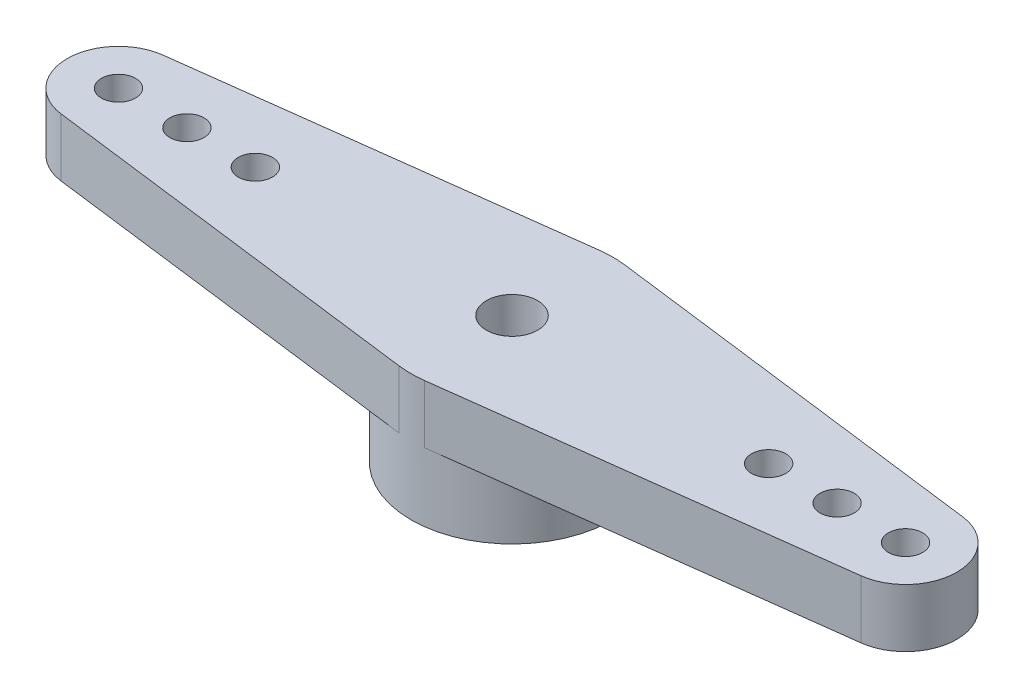
ISO-10303-21;
HEADER;
FILE_DESCRIPTION(('STEP AP214'),'2;1');
FILE_NAME('part.step','',(''),(''),'','','');
FILE_SCHEMA(('AUTOMOTIVE_DESIGN { 1 0 10303 214 1 1 1 1 }'));
ENDSEC;
DATA;
#1=APPLICATION_CONTEXT('core data for automotive mechanical design processes');
#2=APPLICATION_PROTOCOL_DEFINITION('international standard','automotive_design',2000,#1);
#3=PRODUCT_CONTEXT('',#1,'mechanical');
#4=PRODUCT('Part','Part','',(#3));
#5=PRODUCT_RELATED_PRODUCT_CATEGORY('part','',(#4));
#6=PRODUCT_DEFINITION_FORMATION('','',#4);
#7=PRODUCT_DEFINITION_CONTEXT('part definition',#1,'design');
#8=PRODUCT_DEFINITION('design','',#6,#7);
#9=PRODUCT_DEFINITION_SHAPE('','',#8);
#10=(LENGTH_UNIT() NAMED_UNIT(*) SI_UNIT(.MILLI.,.METRE.));
#11=(NAMED_UNIT(*) PLANE_ANGLE_UNIT() SI_UNIT($,.RADIAN.));
#12=(NAMED_UNIT(*) SI_UNIT($,.STERADIAN.) SOLID_ANGLE_UNIT());
#13=UNCERTAINTY_MEASURE_WITH_UNIT(LENGTH_MEASURE(1.E-05),#10,'distance_accuracy_value','');
#14=(GEOMETRIC_REPRESENTATION_CONTEXT(3) GLOBAL_UNCERTAINTY_ASSIGNED_CONTEXT((#13)) GLOBAL_UNIT_ASSIGNED_CONTEXT((#10,
#11,#12)) REPRESENTATION_CONTEXT('',''));
#15=CARTESIAN_POINT('',(0.,0.,0.));
#16=DIRECTION('',(0.,0.,1.));
#17=DIRECTION('',(1.,0.,0.));
#18=AXIS2_PLACEMENT_3D('',#15,#16,#17);
#19=CARTESIAN_POINT('',(0.,0.,0.));
#20=DIRECTION('',(0.,1.,0.));
#21=DIRECTION('',(0.,0.,1.));
#22=AXIS2_PLACEMENT_3D('',#19,#20,#21);
#23=PLANE('',#22);
#24=CARTESIAN_POINT('',(0.,0.,0.));
#25=DIRECTION('',(0.,1.,0.));
#26=DIRECTION('',(0.,0.,1.));
#27=AXIS2_PLACEMENT_3D('',#24,#25,#26);
#28=CIRCLE('',#27,2.95);
#29=CARTESIAN_POINT('',(0.,0.,2.95));
#30=VERTEX_POINT('',#29);
#31=EDGE_CURVE('E37',#30,#30,#28,.T.);
#32=ORIENTED_EDGE('',*,*,#31,.F.);
#33=EDGE_LOOP('',(#32));
#34=FACE_BOUND('',#33,.T.);
#35=CARTESIAN_POINT('',(0.,0.,0.));
#36=DIRECTION('',(0.,1.,0.));
#37=DIRECTION('',(0.,0.,1.));
#38=AXIS2_PLACEMENT_3D('',#35,#36,#37);
#39=CIRCLE('',#38,1.9);
#40=CARTESIAN_POINT('',(0.,0.,1.9));
#41=VERTEX_POINT('',#40);
#42=EDGE_CURVE('E121',#41,#41,#39,.T.);
#43=ORIENTED_EDGE('',*,*,#42,.T.);
#44=EDGE_LOOP('',(#43));
#45=FACE_BOUND('',#44,.T.);
#46=ADVANCED_FACE('F33',(#34,#45),#23,.F.);
#47=CARTESIAN_POINT('',(0.,2.,0.));
#48=DIRECTION('',(0.,-1.,0.));
#49=DIRECTION('',(0.,0.,-1.));
#50=AXIS2_PLACEMENT_3D('',#47,#48,#49);
#51=CYLINDRICAL_SURFACE('',#50,2.95);
#52=CARTESIAN_POINT('',(0.,2.,0.));
#53=DIRECTION('',(0.,1.,0.));
#54=DIRECTION('',(0.,0.,1.));
#55=AXIS2_PLACEMENT_3D('',#52,#53,#54);
#56=CIRCLE('',#55,2.95);
#57=CARTESIAN_POINT('',(0.37195652173913,2.,2.92645661952057));
#58=VERTEX_POINT('',#57);
#59=CARTESIAN_POINT('',(0.371956521739131,2.,-2.92645661952057));
#60=VERTEX_POINT('',#59);
#61=EDGE_CURVE('E11',#58,#60,#56,.T.);
#62=ORIENTED_EDGE('',*,*,#61,.F.);
#63=DIRECTION('',(0.,-1.,0.));
#64=VECTOR('',#63,1.);
#65=CARTESIAN_POINT('',(0.37195652173913,3.7,2.92645661952057));
#66=LINE('',#65,#64);
#67=CARTESIAN_POINT('',(0.37195652173913,3.7,2.92645661952057));
#68=VERTEX_POINT('',#67);
#69=EDGE_CURVE('E279',#68,#58,#66,.T.);
#70=ORIENTED_EDGE('',*,*,#69,.F.);
#71=CARTESIAN_POINT('',(0.,3.7,0.));
#72=DIRECTION('',(0.,1.,0.));
#73=DIRECTION('',(0.,0.,1.));
#74=AXIS2_PLACEMENT_3D('',#71,#72,#73);
#75=CIRCLE('',#74,2.95);
#76=CARTESIAN_POINT('',(-0.371956521739131,3.7,2.92645661952057));
#77=VERTEX_POINT('',#76);
#78=EDGE_CURVE('E253',#77,#68,#75,.T.);
#79=ORIENTED_EDGE('',*,*,#78,.F.);
#80=DIRECTION('',(0.,-1.,0.));
#81=VECTOR('',#80,1.);
#82=CARTESIAN_POINT('',(-0.371956521739131,3.7,2.92645661952057));
#83=LINE('',#82,#81);
#84=CARTESIAN_POINT('',(-0.371956521739131,2.,2.92645661952057));
#85=VERTEX_POINT('',#84);
#86=EDGE_CURVE('E282',#77,#85,#83,.T.);
#87=ORIENTED_EDGE('',*,*,#86,.T.);
#88=CARTESIAN_POINT('',(-0.371956521739131,2.,-2.92645661952057));
#89=VERTEX_POINT('',#88);
#90=EDGE_CURVE('E42',#89,#85,#56,.T.);
#91=ORIENTED_EDGE('',*,*,#90,.F.);
#92=DIRECTION('',(0.,-1.,0.));
#93=VECTOR('',#92,1.);
#94=CARTESIAN_POINT('',(-0.371956521739131,3.7,-2.92645661952057));
#95=LINE('',#94,#93);
#96=CARTESIAN_POINT('',(-0.371956521739131,3.7,-2.92645661952057));
#97=VERTEX_POINT('',#96);
#98=EDGE_CURVE('E100',#97,#89,#95,.T.);
#99=ORIENTED_EDGE('',*,*,#98,.F.);
#100=CARTESIAN_POINT('',(0.,3.7,0.));
#101=DIRECTION('',(0.,1.,0.));
#102=DIRECTION('',(0.,0.,1.));
#103=AXIS2_PLACEMENT_3D('',#100,#101,#102);
#104=CIRCLE('',#103,2.95);
#105=CARTESIAN_POINT('',(0.371956521739131,3.7,-2.92645661952057));
#106=VERTEX_POINT('',#105);
#107=EDGE_CURVE('E106',#106,#97,#104,.T.);
#108=ORIENTED_EDGE('',*,*,#107,.F.);
#109=DIRECTION('',(0.,-1.,0.));
#110=VECTOR('',#109,1.);
#111=CARTESIAN_POINT('',(0.371956521739131,3.7,-2.92645661952057));
#112=LINE('',#111,#110);
#113=EDGE_CURVE('E260',#106,#60,#112,.T.);
#114=ORIENTED_EDGE('',*,*,#113,.T.);
#115=EDGE_LOOP('',(#62,#70,#79,#87,#91,#99,#108,#114));
#116=FACE_BOUND('',#115,.T.);
#117=ORIENTED_EDGE('',*,*,#31,.T.);
#118=EDGE_LOOP('',(#117));
#119=FACE_BOUND('',#118,.T.);
#120=ADVANCED_FACE('F35',(#116,#119),#51,.T.);
#121=CARTESIAN_POINT('',(0.,2.,0.));
#122=DIRECTION('',(0.,-1.,0.));
#123=DIRECTION('',(0.,0.,-1.));
#124=AXIS2_PLACEMENT_3D('',#121,#122,#123);
#125=CYLINDRICAL_SURFACE('',#124,1.9);
#126=CARTESIAN_POINT('',(0.,2.,0.));
#127=DIRECTION('',(0.,1.,0.));
#128=DIRECTION('',(0.,0.,1.));
#129=AXIS2_PLACEMENT_3D('',#126,#127,#128);
#130=CIRCLE('',#129,1.9);
#131=CARTESIAN_POINT('',(0.,2.,1.9));
#132=VERTEX_POINT('',#131);
#133=EDGE_CURVE('E118',#132,#132,#130,.T.);
#134=ORIENTED_EDGE('',*,*,#133,.T.);
#135=EDGE_LOOP('',(#134));
#136=FACE_BOUND('',#135,.T.);
#137=ORIENTED_EDGE('',*,*,#42,.F.);
#138=EDGE_LOOP('',(#137));
#139=FACE_BOUND('',#138,.T.);
#140=ADVANCED_FACE('F137',(#136,#139),#125,.F.);
#141=CARTESIAN_POINT('',(0.,2.,0.));
#142=DIRECTION('',(0.,1.,0.));
#143=DIRECTION('',(0.,0.,1.));
#144=AXIS2_PLACEMENT_3D('',#141,#142,#143);
#145=PLANE('',#144);
#146=CARTESIAN_POINT('',(7.5,2.,0.));
#147=DIRECTION('',(0.,1.,0.));
#148=DIRECTION('',(0.,0.,-1.));
#149=AXIS2_PLACEMENT_3D('',#146,#147,#148);
#150=CIRCLE('',#149,0.500000000000001);
#151=CARTESIAN_POINT('',(7.5,2.,-0.500000000000001));
#152=VERTEX_POINT('',#151);
#153=EDGE_CURVE('E223',#152,#152,#150,.T.);
#154=ORIENTED_EDGE('',*,*,#153,.T.);
#155=EDGE_LOOP('',(#154));
#156=FACE_BOUND('',#155,.T.);
#157=CARTESIAN_POINT('',(9.5,2.,0.));
#158=DIRECTION('',(0.,1.,0.));
#159=DIRECTION('',(0.,0.,-1.));
#160=AXIS2_PLACEMENT_3D('',#157,#158,#159);
#161=CIRCLE('',#160,0.500000000000001);
#162=CARTESIAN_POINT('',(9.5,2.,-0.500000000000001));
#163=VERTEX_POINT('',#162);
#164=EDGE_CURVE('E217',#163,#163,#161,.T.);
#165=ORIENTED_EDGE('',*,*,#164,.T.);
#166=EDGE_LOOP('',(#165));
#167=FACE_BOUND('',#166,.T.);
#168=CARTESIAN_POINT('',(11.5,2.,0.));
#169=DIRECTION('',(0.,1.,0.));
#170=DIRECTION('',(0.,0.,-1.));
#171=AXIS2_PLACEMENT_3D('',#168,#169,#170);
#172=CIRCLE('',#171,0.500000000000001);
#173=CARTESIAN_POINT('',(11.5,2.,-0.500000000000001));
#174=VERTEX_POINT('',#173);
#175=EDGE_CURVE('E211',#174,#174,#172,.T.);
#176=ORIENTED_EDGE('',*,*,#175,.T.);
#177=EDGE_LOOP('',(#176));
#178=FACE_BOUND('',#177,.T.);
#179=DIRECTION('',(0.992019193057818,0.,-0.126086956521739));
#180=VECTOR('',#179,1.);
#181=CARTESIAN_POINT('',(0.371956521739131,2.,2.92645661952057));
#182=LINE('',#181,#180);
#183=CARTESIAN_POINT('',(11.6891304347826,2.,1.48802878958673));
#184=VERTEX_POINT('',#183);
#185=EDGE_CURVE('E266',#58,#184,#182,.T.);
#186=ORIENTED_EDGE('',*,*,#185,.F.);
#187=ORIENTED_EDGE('',*,*,#61,.T.);
#188=DIRECTION('',(-0.992019193057818,0.,-0.126086956521739));
#189=VECTOR('',#188,1.);
#190=CARTESIAN_POINT('',(0.371956521739131,2.,-2.92645661952057));
#191=LINE('',#190,#189);
#192=CARTESIAN_POINT('',(11.6891304347826,2.,-1.48802878958673));
#193=VERTEX_POINT('',#192);
#194=EDGE_CURVE('E115',#193,#60,#191,.T.);
#195=ORIENTED_EDGE('',*,*,#194,.F.);
#196=CARTESIAN_POINT('',(11.5,2.,0.));
#197=DIRECTION('',(0.,1.,0.));
#198=DIRECTION('',(0.,0.,-1.));
#199=AXIS2_PLACEMENT_3D('',#196,#197,#198);
#200=CIRCLE('',#199,1.5);
#201=EDGE_CURVE('E268',#184,#193,#200,.T.);
#202=ORIENTED_EDGE('',*,*,#201,.F.);
#203=EDGE_LOOP('',(#186,#187,#195,#202));
#204=FACE_BOUND('',#203,.T.);
#205=ADVANCED_FACE('F141',(#156,#167,#178,#204),#145,.F.);
#206=CARTESIAN_POINT('',(-11.5,2.,0.));
#207=DIRECTION('',(0.,1.,0.));
#208=DIRECTION('',(0.,0.,1.));
#209=AXIS2_PLACEMENT_3D('',#206,#207,#208);
#210=CIRCLE('',#209,0.500000000000001);
#211=CARTESIAN_POINT('',(-11.5,2.,0.500000000000001));
#212=VERTEX_POINT('',#211);
#213=EDGE_CURVE('E241',#212,#212,#210,.T.);
#214=ORIENTED_EDGE('',*,*,#213,.T.);
#215=EDGE_LOOP('',(#214));
#216=FACE_BOUND('',#215,.T.);
#217=CARTESIAN_POINT('',(-9.5,2.,0.));
#218=DIRECTION('',(0.,1.,0.));
#219=DIRECTION('',(0.,0.,1.));
#220=AXIS2_PLACEMENT_3D('',#217,#218,#219);
#221=CIRCLE('',#220,0.500000000000001);
#222=CARTESIAN_POINT('',(-9.5,2.,0.500000000000001));
#223=VERTEX_POINT('',#222);
#224=EDGE_CURVE('E235',#223,#223,#221,.T.);
#225=ORIENTED_EDGE('',*,*,#224,.T.);
#226=EDGE_LOOP('',(#225));
#227=FACE_BOUND('',#226,.T.);
#228=CARTESIAN_POINT('',(-7.5,2.,0.));
#229=DIRECTION('',(0.,1.,0.));
#230=DIRECTION('',(0.,0.,1.));
#231=AXIS2_PLACEMENT_3D('',#228,#229,#230);
#232=CIRCLE('',#231,0.500000000000001);
#233=CARTESIAN_POINT('',(-7.5,2.,0.500000000000001));
#234=VERTEX_POINT('',#233);
#235=EDGE_CURVE('E229',#234,#234,#232,.T.);
#236=ORIENTED_EDGE('',*,*,#235,.T.);
#237=EDGE_LOOP('',(#236));
#238=FACE_BOUND('',#237,.T.);
#239=DIRECTION('',(-0.992019193057818,0.,0.126086956521739));
#240=VECTOR('',#239,1.);
#241=CARTESIAN_POINT('',(-0.371956521739131,2.,-2.92645661952057));
#242=LINE('',#241,#240);
#243=CARTESIAN_POINT('',(-11.6891304347826,2.,-1.48802878958673));
#244=VERTEX_POINT('',#243);
#245=EDGE_CURVE('E247',#89,#244,#242,.T.);
#246=ORIENTED_EDGE('',*,*,#245,.F.);
#247=ORIENTED_EDGE('',*,*,#90,.T.);
#248=DIRECTION('',(0.992019193057818,0.,0.126086956521739));
#249=VECTOR('',#248,1.);
#250=CARTESIAN_POINT('',(-0.371956521739131,2.,2.92645661952057));
#251=LINE('',#250,#249);
#252=CARTESIAN_POINT('',(-11.6891304347826,2.,1.48802878958673));
#253=VERTEX_POINT('',#252);
#254=EDGE_CURVE('E264',#253,#85,#251,.T.);
#255=ORIENTED_EDGE('',*,*,#254,.F.);
#256=CARTESIAN_POINT('',(-11.5,2.,0.));
#257=DIRECTION('',(0.,1.,0.));
#258=DIRECTION('',(0.,0.,1.));
#259=AXIS2_PLACEMENT_3D('',#256,#257,#258);
#260=CIRCLE('',#259,1.5);
#261=EDGE_CURVE('E262',#244,#253,#260,.T.);
#262=ORIENTED_EDGE('',*,*,#261,.F.);
#263=EDGE_LOOP('',(#246,#247,#255,#262));
#264=FACE_BOUND('',#263,.T.);
#265=ADVANCED_FACE('F170',(#216,#227,#238,#264),#145,.F.);
#266=CARTESIAN_POINT('',(0.,3.7,0.));
#267=DIRECTION('',(0.,1.,0.));
#268=DIRECTION('',(0.,0.,1.));
#269=AXIS2_PLACEMENT_3D('',#266,#267,#268);
#270=PLANE('',#269);
#271=CARTESIAN_POINT('',(11.5,3.7,0.));
#272=DIRECTION('',(0.,1.,0.));
#273=DIRECTION('',(0.,0.,-1.));
#274=AXIS2_PLACEMENT_3D('',#271,#272,#273);
#275=CIRCLE('',#274,0.500000000000001);
#276=CARTESIAN_POINT('',(11.5,3.7,-0.500000000000001));
#277=VERTEX_POINT('',#276);
#278=EDGE_CURVE('E214',#277,#277,#275,.T.);
#279=ORIENTED_EDGE('',*,*,#278,.F.);
#280=EDGE_LOOP('',(#279));
#281=FACE_BOUND('',#280,.T.);
#282=CARTESIAN_POINT('',(7.5,3.7,0.));
#283=DIRECTION('',(0.,1.,0.));
#284=DIRECTION('',(0.,0.,-1.));
#285=AXIS2_PLACEMENT_3D('',#282,#283,#284);
#286=CIRCLE('',#285,0.500000000000001);
#287=CARTESIAN_POINT('',(7.5,3.7,-0.500000000000001));
#288=VERTEX_POINT('',#287);
#289=EDGE_CURVE('E226',#288,#288,#286,.T.);
#290=ORIENTED_EDGE('',*,*,#289,.F.);
#291=EDGE_LOOP('',(#290));
#292=FACE_BOUND('',#291,.T.);
#293=CARTESIAN_POINT('',(-9.5,3.7,0.));
#294=DIRECTION('',(0.,1.,0.));
#295=DIRECTION('',(0.,0.,1.));
#296=AXIS2_PLACEMENT_3D('',#293,#294,#295);
#297=CIRCLE('',#296,0.500000000000001);
#298=CARTESIAN_POINT('',(-9.5,3.7,0.500000000000001));
#299=VERTEX_POINT('',#298);
#300=EDGE_CURVE('E238',#299,#299,#297,.T.);
#301=ORIENTED_EDGE('',*,*,#300,.F.);
#302=EDGE_LOOP('',(#301));
#303=FACE_BOUND('',#302,.T.);
#304=ORIENTED_EDGE('',*,*,#107,.T.);
#305=DIRECTION('',(-0.992019193057818,0.,0.126086956521739));
#306=VECTOR('',#305,1.);
#307=CARTESIAN_POINT('',(-0.371956521739131,3.7,-2.92645661952057));
#308=LINE('',#307,#306);
#309=CARTESIAN_POINT('',(-11.6891304347826,3.7,-1.48802878958673));
#310=VERTEX_POINT('',#309);
#311=EDGE_CURVE('E97',#97,#310,#308,.T.);
#312=ORIENTED_EDGE('',*,*,#311,.T.);
#313=CARTESIAN_POINT('',(-11.5,3.7,0.));
#314=DIRECTION('',(0.,1.,0.));
#315=DIRECTION('',(0.,0.,1.));
#316=AXIS2_PLACEMENT_3D('',#313,#314,#315);
#317=CIRCLE('',#316,1.5);
#318=CARTESIAN_POINT('',(-11.6891304347826,3.7,1.48802878958673));
#319=VERTEX_POINT('',#318);
#320=EDGE_CURVE('E105',#310,#319,#317,.T.);
#321=ORIENTED_EDGE('',*,*,#320,.T.);
#322=DIRECTION('',(0.992019193057818,0.,0.126086956521739));
#323=VECTOR('',#322,1.);
#324=CARTESIAN_POINT('',(-0.371956521739131,3.7,2.92645661952057));
#325=LINE('',#324,#323);
#326=EDGE_CURVE('E251',#319,#77,#325,.T.);
#327=ORIENTED_EDGE('',*,*,#326,.T.);
#328=ORIENTED_EDGE('',*,*,#78,.T.);
#329=DIRECTION('',(0.992019193057818,0.,-0.126086956521739));
#330=VECTOR('',#329,1.);
#331=CARTESIAN_POINT('',(0.371956521739131,3.7,2.92645661952057));
#332=LINE('',#331,#330);
#333=CARTESIAN_POINT('',(11.6891304347826,3.7,1.48802878958673));
#334=VERTEX_POINT('',#333);
#335=EDGE_CURVE('E255',#68,#334,#332,.T.);
#336=ORIENTED_EDGE('',*,*,#335,.T.);
#337=CARTESIAN_POINT('',(11.5,3.7,0.));
#338=DIRECTION('',(0.,1.,0.));
#339=DIRECTION('',(0.,0.,-1.));
#340=AXIS2_PLACEMENT_3D('',#337,#338,#339);
#341=CIRCLE('',#340,1.5);
#342=CARTESIAN_POINT('',(11.6891304347826,3.7,-1.48802878958673));
#343=VERTEX_POINT('',#342);
#344=EDGE_CURVE('E257',#334,#343,#341,.T.);
#345=ORIENTED_EDGE('',*,*,#344,.T.);
#346=DIRECTION('',(-0.992019193057818,0.,-0.126086956521739));
#347=VECTOR('',#346,1.);
#348=CARTESIAN_POINT('',(0.371956521739131,3.7,-2.92645661952057));
#349=LINE('',#348,#347);
#350=EDGE_CURVE('E112',#343,#106,#349,.T.);
#351=ORIENTED_EDGE('',*,*,#350,.T.);
#352=EDGE_LOOP('',(#304,#312,#321,#327,#328,#336,#345,#351));
#353=FACE_BOUND('',#352,.T.);
#354=CARTESIAN_POINT('',(-11.5,3.7,0.));
#355=DIRECTION('',(0.,1.,0.));
#356=DIRECTION('',(0.,0.,1.));
#357=AXIS2_PLACEMENT_3D('',#354,#355,#356);
#358=CIRCLE('',#357,0.500000000000001);
#359=CARTESIAN_POINT('',(-11.5,3.7,0.500000000000001));
#360=VERTEX_POINT('',#359);
#361=EDGE_CURVE('E244',#360,#360,#358,.T.);
#362=ORIENTED_EDGE('',*,*,#361,.F.);
#363=EDGE_LOOP('',(#362));
#364=FACE_BOUND('',#363,.T.);
#365=CARTESIAN_POINT('',(-7.5,3.7,0.));
#366=DIRECTION('',(0.,1.,0.));
#367=DIRECTION('',(0.,0.,1.));
#368=AXIS2_PLACEMENT_3D('',#365,#366,#367);
#369=CIRCLE('',#368,0.500000000000001);
#370=CARTESIAN_POINT('',(-7.5,3.7,0.500000000000001));
#371=VERTEX_POINT('',#370);
#372=EDGE_CURVE('E232',#371,#371,#369,.T.);
#373=ORIENTED_EDGE('',*,*,#372,.F.);
#374=EDGE_LOOP('',(#373));
#375=FACE_BOUND('',#374,.T.);
#376=CARTESIAN_POINT('',(9.5,3.7,0.));
#377=DIRECTION('',(0.,1.,0.));
#378=DIRECTION('',(0.,0.,-1.));
#379=AXIS2_PLACEMENT_3D('',#376,#377,#378);
#380=CIRCLE('',#379,0.500000000000001);
#381=CARTESIAN_POINT('',(9.5,3.7,-0.500000000000001));
#382=VERTEX_POINT('',#381);
#383=EDGE_CURVE('E220',#382,#382,#380,.T.);
#384=ORIENTED_EDGE('',*,*,#383,.F.);
#385=EDGE_LOOP('',(#384));
#386=FACE_BOUND('',#385,.T.);
#387=CARTESIAN_POINT('',(0.,3.7,0.));
#388=DIRECTION('',(0.,1.,0.));
#389=DIRECTION('',(0.,0.,1.));
#390=AXIS2_PLACEMENT_3D('',#387,#388,#389);
#391=CIRCLE('',#390,0.75);
#392=CARTESIAN_POINT('',(0.,3.7,0.75));
#393=VERTEX_POINT('',#392);
#394=EDGE_CURVE('E205',#393,#393,#391,.T.);
#395=ORIENTED_EDGE('',*,*,#394,.F.);
#396=EDGE_LOOP('',(#395));
#397=FACE_BOUND('',#396,.T.);
#398=ADVANCED_FACE('F109',(#281,#292,#303,#353,#364,#375,#386,#397),#270,.T.);
#399=ORIENTED_EDGE('',*,*,#133,.F.);
#400=EDGE_LOOP('',(#399));
#401=FACE_BOUND('',#400,.T.);
#402=CARTESIAN_POINT('',(0.,2.,0.));
#403=DIRECTION('',(0.,1.,0.));
#404=DIRECTION('',(0.,0.,1.));
#405=AXIS2_PLACEMENT_3D('',#402,#403,#404);
#406=CIRCLE('',#405,0.75);
#407=CARTESIAN_POINT('',(0.,2.,0.75));
#408=VERTEX_POINT('',#407);
#409=EDGE_CURVE('E208',#408,#408,#406,.T.);
#410=ORIENTED_EDGE('',*,*,#409,.T.);
#411=EDGE_LOOP('',(#410));
#412=FACE_BOUND('',#411,.T.);
#413=ADVANCED_FACE('F146',(#401,#412),#145,.F.);
#414=CARTESIAN_POINT('',(-0.371956521739131,3.7,-2.92645661952057));
#415=DIRECTION('',(0.126086956521739,0.,0.992019193057818));
#416=DIRECTION('',(0.992019193057818,0.,-0.126086956521739));
#417=AXIS2_PLACEMENT_3D('',#414,#415,#416);
#418=PLANE('',#417);
#419=ORIENTED_EDGE('',*,*,#245,.T.);
#420=DIRECTION('',(0.,-1.,0.));
#421=VECTOR('',#420,1.);
#422=CARTESIAN_POINT('',(-11.6891304347826,3.7,-1.48802878958673));
#423=LINE('',#422,#421);
#424=EDGE_CURVE('E102',#310,#244,#423,.T.);
#425=ORIENTED_EDGE('',*,*,#424,.F.);
#426=ORIENTED_EDGE('',*,*,#311,.F.);
#427=ORIENTED_EDGE('',*,*,#98,.T.);
#428=EDGE_LOOP('',(#419,#425,#426,#427));
#429=FACE_BOUND('',#428,.T.);
#430=ADVANCED_FACE('F99',(#429),#418,.F.);
#431=CARTESIAN_POINT('',(-11.5,3.7,0.));
#432=DIRECTION('',(0.,-1.,0.));
#433=DIRECTION('',(0.,0.,-1.));
#434=AXIS2_PLACEMENT_3D('',#431,#432,#433);
#435=CYLINDRICAL_SURFACE('',#434,1.5);
#436=ORIENTED_EDGE('',*,*,#261,.T.);
#437=DIRECTION('',(0.,-1.,0.));
#438=VECTOR('',#437,1.);
#439=CARTESIAN_POINT('',(-11.6891304347826,3.7,1.48802878958673));
#440=LINE('',#439,#438);
#441=EDGE_CURVE('E123',#319,#253,#440,.T.);
#442=ORIENTED_EDGE('',*,*,#441,.F.);
#443=ORIENTED_EDGE('',*,*,#320,.F.);
#444=ORIENTED_EDGE('',*,*,#424,.T.);
#445=EDGE_LOOP('',(#436,#442,#443,#444));
#446=FACE_BOUND('',#445,.T.);
#447=ADVANCED_FACE('F145',(#446),#435,.T.);
#448=CARTESIAN_POINT('',(-0.371956521739131,3.7,2.92645661952057));
#449=DIRECTION('',(0.126086956521739,0.,-0.992019193057818));
#450=DIRECTION('',(-0.992019193057818,0.,-0.126086956521739));
#451=AXIS2_PLACEMENT_3D('',#448,#449,#450);
#452=PLANE('',#451);
#453=ORIENTED_EDGE('',*,*,#254,.T.);
#454=ORIENTED_EDGE('',*,*,#86,.F.);
#455=ORIENTED_EDGE('',*,*,#326,.F.);
#456=ORIENTED_EDGE('',*,*,#441,.T.);
#457=EDGE_LOOP('',(#453,#454,#455,#456));
#458=FACE_BOUND('',#457,.T.);
#459=ADVANCED_FACE('F149',(#458),#452,.F.);
#460=CARTESIAN_POINT('',(0.371956521739131,3.7,2.92645661952057));
#461=DIRECTION('',(-0.126086956521739,0.,-0.992019193057818));
#462=DIRECTION('',(-0.992019193057818,0.,0.126086956521739));
#463=AXIS2_PLACEMENT_3D('',#460,#461,#462);
#464=PLANE('',#463);
#465=ORIENTED_EDGE('',*,*,#185,.T.);
#466=DIRECTION('',(0.,-1.,0.));
#467=VECTOR('',#466,1.);
#468=CARTESIAN_POINT('',(11.6891304347826,3.7,1.48802878958673));
#469=LINE('',#468,#467);
#470=EDGE_CURVE('E276',#334,#184,#469,.T.);
#471=ORIENTED_EDGE('',*,*,#470,.F.);
#472=ORIENTED_EDGE('',*,*,#335,.F.);
#473=ORIENTED_EDGE('',*,*,#69,.T.);
#474=EDGE_LOOP('',(#465,#471,#472,#473));
#475=FACE_BOUND('',#474,.T.);
#476=ADVANCED_FACE('F153',(#475),#464,.F.);
#477=CARTESIAN_POINT('',(11.5,3.7,0.));
#478=DIRECTION('',(0.,-1.,0.));
#479=DIRECTION('',(0.,0.,-1.));
#480=AXIS2_PLACEMENT_3D('',#477,#478,#479);
#481=CYLINDRICAL_SURFACE('',#480,1.5);
#482=ORIENTED_EDGE('',*,*,#201,.T.);
#483=DIRECTION('',(0.,-1.,0.));
#484=VECTOR('',#483,1.);
#485=CARTESIAN_POINT('',(11.6891304347826,3.7,-1.48802878958673));
#486=LINE('',#485,#484);
#487=EDGE_CURVE('E273',#343,#193,#486,.T.);
#488=ORIENTED_EDGE('',*,*,#487,.F.);
#489=ORIENTED_EDGE('',*,*,#344,.F.);
#490=ORIENTED_EDGE('',*,*,#470,.T.);
#491=EDGE_LOOP('',(#482,#488,#489,#490));
#492=FACE_BOUND('',#491,.T.);
#493=ADVANCED_FACE('F157',(#492),#481,.T.);
#494=CARTESIAN_POINT('',(0.371956521739131,3.7,-2.92645661952057));
#495=DIRECTION('',(-0.126086956521739,0.,0.992019193057818));
#496=DIRECTION('',(0.992019193057818,0.,0.126086956521739));
#497=AXIS2_PLACEMENT_3D('',#494,#495,#496);
#498=PLANE('',#497);
#499=ORIENTED_EDGE('',*,*,#194,.T.);
#500=ORIENTED_EDGE('',*,*,#113,.F.);
#501=ORIENTED_EDGE('',*,*,#350,.F.);
#502=ORIENTED_EDGE('',*,*,#487,.T.);
#503=EDGE_LOOP('',(#499,#500,#501,#502));
#504=FACE_BOUND('',#503,.T.);
#505=ADVANCED_FACE('F161',(#504),#498,.F.);
#506=CARTESIAN_POINT('',(-11.5,3.7,0.));
#507=DIRECTION('',(0.,-1.,0.));
#508=DIRECTION('',(0.,0.,-1.));
#509=AXIS2_PLACEMENT_3D('',#506,#507,#508);
#510=CYLINDRICAL_SURFACE('',#509,0.500000000000001);
#511=ORIENTED_EDGE('',*,*,#361,.T.);
#512=EDGE_LOOP('',(#511));
#513=FACE_BOUND('',#512,.T.);
#514=ORIENTED_EDGE('',*,*,#213,.F.);
#515=EDGE_LOOP('',(#514));
#516=FACE_BOUND('',#515,.T.);
#517=ADVANCED_FACE('F165',(#513,#516),#510,.F.);
#518=CARTESIAN_POINT('',(-9.5,3.7,0.));
#519=DIRECTION('',(0.,-1.,0.));
#520=DIRECTION('',(0.,0.,-1.));
#521=AXIS2_PLACEMENT_3D('',#518,#519,#520);
#522=CYLINDRICAL_SURFACE('',#521,0.500000000000001);
#523=ORIENTED_EDGE('',*,*,#300,.T.);
#524=EDGE_LOOP('',(#523));
#525=FACE_BOUND('',#524,.T.);
#526=ORIENTED_EDGE('',*,*,#224,.F.);
#527=EDGE_LOOP('',(#526));
#528=FACE_BOUND('',#527,.T.);
#529=ADVANCED_FACE('F176',(#525,#528),#522,.F.);
#530=CARTESIAN_POINT('',(-7.5,3.7,0.));
#531=DIRECTION('',(0.,-1.,0.));
#532=DIRECTION('',(0.,0.,-1.));
#533=AXIS2_PLACEMENT_3D('',#530,#531,#532);
#534=CYLINDRICAL_SURFACE('',#533,0.500000000000001);
#535=ORIENTED_EDGE('',*,*,#372,.T.);
#536=EDGE_LOOP('',(#535));
#537=FACE_BOUND('',#536,.T.);
#538=ORIENTED_EDGE('',*,*,#235,.F.);
#539=EDGE_LOOP('',(#538));
#540=FACE_BOUND('',#539,.T.);
#541=ADVANCED_FACE('F180',(#537,#540),#534,.F.);
#542=CARTESIAN_POINT('',(7.5,3.7,0.));
#543=DIRECTION('',(0.,-1.,0.));
#544=DIRECTION('',(0.,0.,-1.));
#545=AXIS2_PLACEMENT_3D('',#542,#543,#544);
#546=CYLINDRICAL_SURFACE('',#545,0.500000000000001);
#547=ORIENTED_EDGE('',*,*,#289,.T.);
#548=EDGE_LOOP('',(#547));
#549=FACE_BOUND('',#548,.T.);
#550=ORIENTED_EDGE('',*,*,#153,.F.);
#551=EDGE_LOOP('',(#550));
#552=FACE_BOUND('',#551,.T.);
#553=ADVANCED_FACE('F184',(#549,#552),#546,.F.);
#554=CARTESIAN_POINT('',(9.5,3.7,0.));
#555=DIRECTION('',(0.,-1.,0.));
#556=DIRECTION('',(0.,0.,-1.));
#557=AXIS2_PLACEMENT_3D('',#554,#555,#556);
#558=CYLINDRICAL_SURFACE('',#557,0.500000000000001);
#559=ORIENTED_EDGE('',*,*,#383,.T.);
#560=EDGE_LOOP('',(#559));
#561=FACE_BOUND('',#560,.T.);
#562=ORIENTED_EDGE('',*,*,#164,.F.);
#563=EDGE_LOOP('',(#562));
#564=FACE_BOUND('',#563,.T.);
#565=ADVANCED_FACE('F188',(#561,#564),#558,.F.);
#566=CARTESIAN_POINT('',(11.5,3.7,0.));
#567=DIRECTION('',(0.,-1.,0.));
#568=DIRECTION('',(0.,0.,-1.));
#569=AXIS2_PLACEMENT_3D('',#566,#567,#568);
#570=CYLINDRICAL_SURFACE('',#569,0.500000000000001);
#571=ORIENTED_EDGE('',*,*,#278,.T.);
#572=EDGE_LOOP('',(#571));
#573=FACE_BOUND('',#572,.T.);
#574=ORIENTED_EDGE('',*,*,#175,.F.);
#575=EDGE_LOOP('',(#574));
#576=FACE_BOUND('',#575,.T.);
#577=ADVANCED_FACE('F192',(#573,#576),#570,.F.);
#578=CARTESIAN_POINT('',(0.,3.7,0.));
#579=DIRECTION('',(0.,-1.,0.));
#580=DIRECTION('',(0.,0.,-1.));
#581=AXIS2_PLACEMENT_3D('',#578,#579,#580);
#582=CYLINDRICAL_SURFACE('',#581,0.75);
#583=ORIENTED_EDGE('',*,*,#394,.T.);
#584=EDGE_LOOP('',(#583));
#585=FACE_BOUND('',#584,.T.);
#586=ORIENTED_EDGE('',*,*,#409,.F.);
#587=EDGE_LOOP('',(#586));
#588=FACE_BOUND('',#587,.T.);
#589=ADVANCED_FACE('F196',(#585,#588),#582,.F.);
#590=CLOSED_SHELL('',(#46,#120,#140,#205,#265,#398,#413,#430,#447,#459,#476,#493,#505,#517,#529,
#541,#553,#565,#577,#589));
#591=MANIFOLD_SOLID_BREP('B2',#590);
#592=ADVANCED_BREP_SHAPE_REPRESENTATION('',(#18,#591),#14);
#593=SHAPE_DEFINITION_REPRESENTATION(#9,#592);
ENDSEC;
END-ISO-10303-21;
